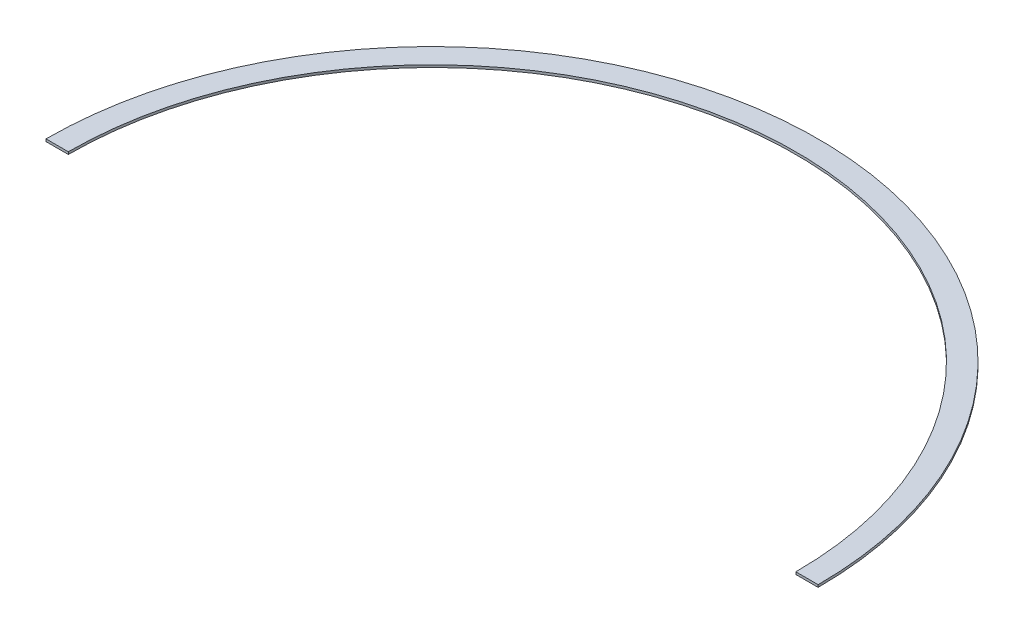
ISO-10303-21;
HEADER;
FILE_DESCRIPTION(('STEP AP214'),'2;1');
FILE_NAME('part.step','',(''),(''),'','','');
FILE_SCHEMA(('AUTOMOTIVE_DESIGN { 1 0 10303 214 1 1 1 1 }'));
ENDSEC;
DATA;
#1=APPLICATION_CONTEXT('core data for automotive mechanical design processes');
#2=APPLICATION_PROTOCOL_DEFINITION('international standard','automotive_design',2000,#1);
#3=PRODUCT_CONTEXT('',#1,'mechanical');
#4=PRODUCT('Part','Part','',(#3));
#5=PRODUCT_RELATED_PRODUCT_CATEGORY('part','',(#4));
#6=PRODUCT_DEFINITION_FORMATION('','',#4);
#7=PRODUCT_DEFINITION_CONTEXT('part definition',#1,'design');
#8=PRODUCT_DEFINITION('design','',#6,#7);
#9=PRODUCT_DEFINITION_SHAPE('','',#8);
#10=(LENGTH_UNIT() NAMED_UNIT(*) SI_UNIT(.MILLI.,.METRE.));
#11=(NAMED_UNIT(*) PLANE_ANGLE_UNIT() SI_UNIT($,.RADIAN.));
#12=(NAMED_UNIT(*) SI_UNIT($,.STERADIAN.) SOLID_ANGLE_UNIT());
#13=UNCERTAINTY_MEASURE_WITH_UNIT(LENGTH_MEASURE(1.E-05),#10,'distance_accuracy_value','');
#14=(GEOMETRIC_REPRESENTATION_CONTEXT(3) GLOBAL_UNCERTAINTY_ASSIGNED_CONTEXT((#13)) GLOBAL_UNIT_ASSIGNED_CONTEXT((#10,
#11,#12)) REPRESENTATION_CONTEXT('',''));
#15=CARTESIAN_POINT('',(0.,0.,0.));
#16=DIRECTION('',(0.,0.,1.));
#17=DIRECTION('',(1.,0.,0.));
#18=AXIS2_PLACEMENT_3D('',#15,#16,#17);
#19=CARTESIAN_POINT('',(0.,1.,0.));
#20=DIRECTION('',(0.,-1.,0.));
#21=DIRECTION('',(0.,0.,-1.));
#22=AXIS2_PLACEMENT_3D('',#19,#20,#21);
#23=CYLINDRICAL_SURFACE('',#22,152.17);
#24=CARTESIAN_POINT('',(0.,0.,0.));
#25=DIRECTION('',(0.,-1.,0.));
#26=DIRECTION('',(0.,0.,1.));
#27=AXIS2_PLACEMENT_3D('',#24,#25,#26);
#28=CIRCLE('',#27,152.17);
#29=CARTESIAN_POINT('',(-152.17,0.,0.));
#30=VERTEX_POINT('',#29);
#31=CARTESIAN_POINT('',(152.17,0.,0.));
#32=VERTEX_POINT('',#31);
#33=EDGE_CURVE('E96',#30,#32,#28,.T.);
#34=ORIENTED_EDGE('',*,*,#33,.T.);
#35=DIRECTION('',(0.,-1.,0.));
#36=VECTOR('',#35,1.);
#37=CARTESIAN_POINT('',(152.17,1.,0.));
#38=LINE('',#37,#36);
#39=CARTESIAN_POINT('',(152.17,1.,0.));
#40=VERTEX_POINT('',#39);
#41=EDGE_CURVE('E11',#40,#32,#38,.T.);
#42=ORIENTED_EDGE('',*,*,#41,.F.);
#43=CARTESIAN_POINT('',(0.,1.,0.));
#44=DIRECTION('',(0.,-1.,0.));
#45=DIRECTION('',(0.,0.,1.));
#46=AXIS2_PLACEMENT_3D('',#43,#44,#45);
#47=CIRCLE('',#46,152.17);
#48=CARTESIAN_POINT('',(-152.17,1.,0.));
#49=VERTEX_POINT('',#48);
#50=EDGE_CURVE('E84',#49,#40,#47,.T.);
#51=ORIENTED_EDGE('',*,*,#50,.F.);
#52=DIRECTION('',(0.,-1.,0.));
#53=VECTOR('',#52,1.);
#54=CARTESIAN_POINT('',(-152.17,1.,0.));
#55=LINE('',#54,#53);
#56=EDGE_CURVE('E92',#49,#30,#55,.T.);
#57=ORIENTED_EDGE('',*,*,#56,.T.);
#58=EDGE_LOOP('',(#34,#42,#51,#57));
#59=FACE_BOUND('',#58,.T.);
#60=ADVANCED_FACE('F33',(#59),#23,.F.);
#61=CARTESIAN_POINT('',(152.17,1.,0.));
#62=DIRECTION('',(0.,0.,-1.));
#63=DIRECTION('',(-1.,0.,0.));
#64=AXIS2_PLACEMENT_3D('',#61,#62,#63);
#65=PLANE('',#64);
#66=DIRECTION('',(1.,0.,0.));
#67=VECTOR('',#66,1.);
#68=CARTESIAN_POINT('',(152.17,0.,0.));
#69=LINE('',#68,#67);
#70=CARTESIAN_POINT('',(161.5,0.,0.));
#71=VERTEX_POINT('',#70);
#72=EDGE_CURVE('E88',#32,#71,#69,.T.);
#73=ORIENTED_EDGE('',*,*,#72,.T.);
#74=DIRECTION('',(0.,-1.,0.));
#75=VECTOR('',#74,1.);
#76=CARTESIAN_POINT('',(161.5,1.,0.));
#77=LINE('',#76,#75);
#78=CARTESIAN_POINT('',(161.5,1.,0.));
#79=VERTEX_POINT('',#78);
#80=EDGE_CURVE('E41',#79,#71,#77,.T.);
#81=ORIENTED_EDGE('',*,*,#80,.F.);
#82=DIRECTION('',(1.,0.,0.));
#83=VECTOR('',#82,1.);
#84=CARTESIAN_POINT('',(152.17,1.,0.));
#85=LINE('',#84,#83);
#86=EDGE_CURVE('E79',#40,#79,#85,.T.);
#87=ORIENTED_EDGE('',*,*,#86,.F.);
#88=ORIENTED_EDGE('',*,*,#41,.T.);
#89=EDGE_LOOP('',(#73,#81,#87,#88));
#90=FACE_BOUND('',#89,.T.);
#91=ADVANCED_FACE('F87',(#90),#65,.F.);
#92=CARTESIAN_POINT('',(0.,1.,0.));
#93=DIRECTION('',(0.,-1.,0.));
#94=DIRECTION('',(0.,0.,-1.));
#95=AXIS2_PLACEMENT_3D('',#92,#93,#94);
#96=CYLINDRICAL_SURFACE('',#95,161.5);
#97=CARTESIAN_POINT('',(0.,0.,0.));
#98=DIRECTION('',(0.,1.,0.));
#99=DIRECTION('',(0.,0.,1.));
#100=AXIS2_PLACEMENT_3D('',#97,#98,#99);
#101=CIRCLE('',#100,161.5);
#102=CARTESIAN_POINT('',(-161.5,0.,0.));
#103=VERTEX_POINT('',#102);
#104=EDGE_CURVE('E66',#71,#103,#101,.T.);
#105=ORIENTED_EDGE('',*,*,#104,.T.);
#106=DIRECTION('',(0.,-1.,0.));
#107=VECTOR('',#106,1.);
#108=CARTESIAN_POINT('',(-161.5,1.,0.));
#109=LINE('',#108,#107);
#110=CARTESIAN_POINT('',(-161.5,1.,0.));
#111=VERTEX_POINT('',#110);
#112=EDGE_CURVE('E89',#111,#103,#109,.T.);
#113=ORIENTED_EDGE('',*,*,#112,.F.);
#114=CARTESIAN_POINT('',(0.,1.,0.));
#115=DIRECTION('',(0.,1.,0.));
#116=DIRECTION('',(0.,0.,1.));
#117=AXIS2_PLACEMENT_3D('',#114,#115,#116);
#118=CIRCLE('',#117,161.5);
#119=EDGE_CURVE('E82',#79,#111,#118,.T.);
#120=ORIENTED_EDGE('',*,*,#119,.F.);
#121=ORIENTED_EDGE('',*,*,#80,.T.);
#122=EDGE_LOOP('',(#105,#113,#120,#121));
#123=FACE_BOUND('',#122,.T.);
#124=ADVANCED_FACE('F90',(#123),#96,.T.);
#125=CARTESIAN_POINT('',(-161.5,1.,0.));
#126=DIRECTION('',(0.,0.,-1.));
#127=DIRECTION('',(-1.,0.,0.));
#128=AXIS2_PLACEMENT_3D('',#125,#126,#127);
#129=PLANE('',#128);
#130=DIRECTION('',(1.,0.,0.));
#131=VECTOR('',#130,1.);
#132=CARTESIAN_POINT('',(-161.5,0.,0.));
#133=LINE('',#132,#131);
#134=EDGE_CURVE('E72',#103,#30,#133,.T.);
#135=ORIENTED_EDGE('',*,*,#134,.T.);
#136=ORIENTED_EDGE('',*,*,#56,.F.);
#137=DIRECTION('',(1.,0.,0.));
#138=VECTOR('',#137,1.);
#139=CARTESIAN_POINT('',(-161.5,1.,0.));
#140=LINE('',#139,#138);
#141=EDGE_CURVE('E49',#111,#49,#140,.T.);
#142=ORIENTED_EDGE('',*,*,#141,.F.);
#143=ORIENTED_EDGE('',*,*,#112,.T.);
#144=EDGE_LOOP('',(#135,#136,#142,#143));
#145=FACE_BOUND('',#144,.T.);
#146=ADVANCED_FACE('F103',(#145),#129,.F.);
#147=CARTESIAN_POINT('',(0.,1.,0.));
#148=DIRECTION('',(0.,1.,0.));
#149=DIRECTION('',(0.,0.,1.));
#150=AXIS2_PLACEMENT_3D('',#147,#148,#149);
#151=PLANE('',#150);
#152=ORIENTED_EDGE('',*,*,#50,.T.);
#153=ORIENTED_EDGE('',*,*,#86,.T.);
#154=ORIENTED_EDGE('',*,*,#119,.T.);
#155=ORIENTED_EDGE('',*,*,#141,.T.);
#156=EDGE_LOOP('',(#152,#153,#154,#155));
#157=FACE_BOUND('',#156,.T.);
#158=ADVANCED_FACE('F80',(#157),#151,.T.);
#159=CARTESIAN_POINT('',(0.,0.,0.));
#160=DIRECTION('',(0.,1.,0.));
#161=DIRECTION('',(0.,0.,1.));
#162=AXIS2_PLACEMENT_3D('',#159,#160,#161);
#163=PLANE('',#162);
#164=ORIENTED_EDGE('',*,*,#33,.F.);
#165=ORIENTED_EDGE('',*,*,#134,.F.);
#166=ORIENTED_EDGE('',*,*,#104,.F.);
#167=ORIENTED_EDGE('',*,*,#72,.F.);
#168=EDGE_LOOP('',(#164,#165,#166,#167));
#169=FACE_BOUND('',#168,.T.);
#170=ADVANCED_FACE('F106',(#169),#163,.F.);
#171=CLOSED_SHELL('',(#60,#91,#124,#146,#158,#170));
#172=MANIFOLD_SOLID_BREP('B2',#171);
#173=ADVANCED_BREP_SHAPE_REPRESENTATION('',(#18,#172),#14);
#174=SHAPE_DEFINITION_REPRESENTATION(#9,#173);
ENDSEC;
END-ISO-10303-21;
